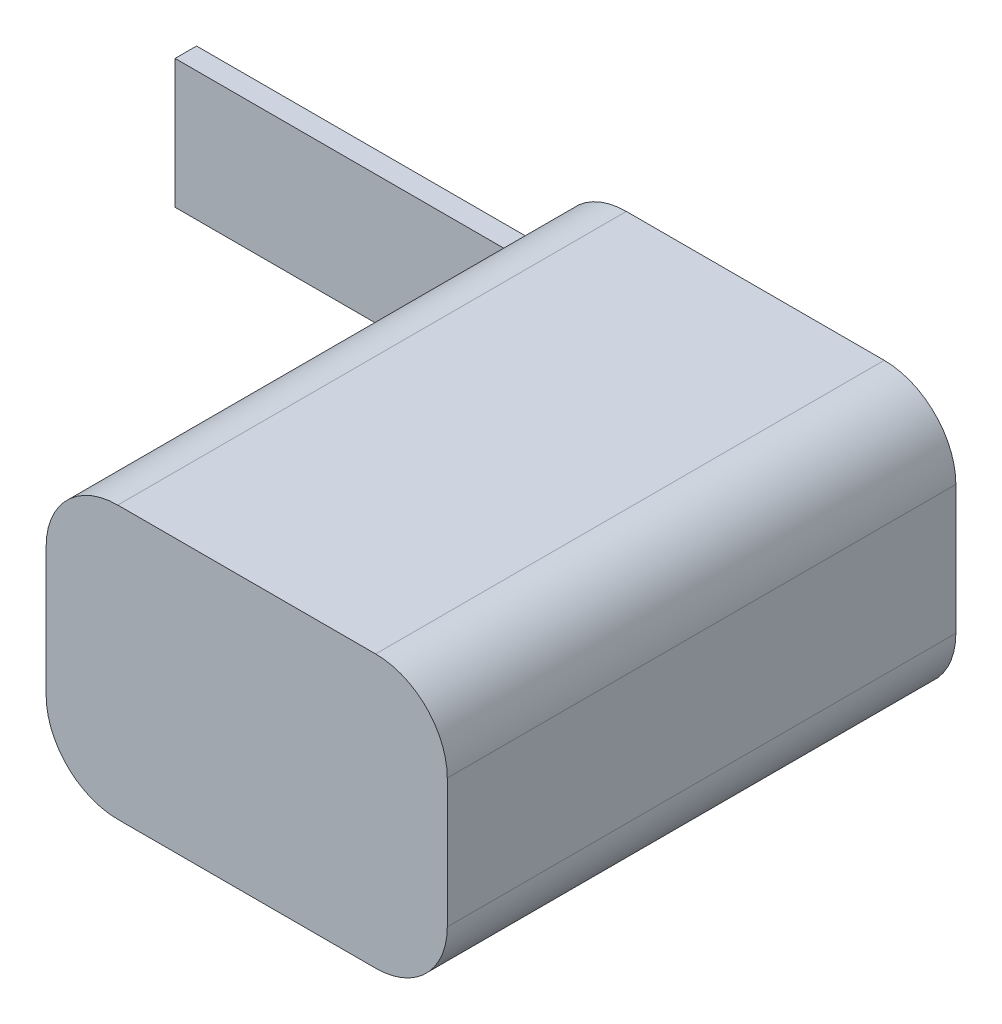
ISO-10303-21;
HEADER;
FILE_DESCRIPTION(('STEP AP214'),'2;1');
FILE_NAME('part.step','',(''),(''),'','','');
FILE_SCHEMA(('AUTOMOTIVE_DESIGN { 1 0 10303 214 1 1 1 1 }'));
ENDSEC;
DATA;
#1=APPLICATION_CONTEXT('core data for automotive mechanical design processes');
#2=APPLICATION_PROTOCOL_DEFINITION('international standard','automotive_design',2000,#1);
#3=PRODUCT_CONTEXT('',#1,'mechanical');
#4=PRODUCT('Part','Part','',(#3));
#5=PRODUCT_RELATED_PRODUCT_CATEGORY('part','',(#4));
#6=PRODUCT_DEFINITION_FORMATION('','',#4);
#7=PRODUCT_DEFINITION_CONTEXT('part definition',#1,'design');
#8=PRODUCT_DEFINITION('design','',#6,#7);
#9=PRODUCT_DEFINITION_SHAPE('','',#8);
#10=(LENGTH_UNIT() NAMED_UNIT(*) SI_UNIT(.MILLI.,.METRE.));
#11=(NAMED_UNIT(*) PLANE_ANGLE_UNIT() SI_UNIT($,.RADIAN.));
#12=(NAMED_UNIT(*) SI_UNIT($,.STERADIAN.) SOLID_ANGLE_UNIT());
#13=UNCERTAINTY_MEASURE_WITH_UNIT(LENGTH_MEASURE(1.E-05),#10,'distance_accuracy_value','');
#14=(GEOMETRIC_REPRESENTATION_CONTEXT(3) GLOBAL_UNCERTAINTY_ASSIGNED_CONTEXT((#13)) GLOBAL_UNIT_ASSIGNED_CONTEXT((#10,
#11,#12)) REPRESENTATION_CONTEXT('',''));
#15=CARTESIAN_POINT('',(0.,0.,0.));
#16=DIRECTION('',(0.,0.,1.));
#17=DIRECTION('',(1.,0.,0.));
#18=AXIS2_PLACEMENT_3D('',#15,#16,#17);
#19=CARTESIAN_POINT('',(0.,0.,71.));
#20=DIRECTION('',(1.,0.,0.));
#21=DIRECTION('',(0.,0.,-1.));
#22=AXIS2_PLACEMENT_3D('',#19,#20,#21);
#23=PLANE('',#22);
#24=DIRECTION('',(0.,1.,0.));
#25=VECTOR('',#24,1.);
#26=CARTESIAN_POINT('',(0.,28.,3.));
#27=LINE('',#26,#25);
#28=CARTESIAN_POINT('',(0.,10.,3.));
#29=VERTEX_POINT('',#28);
#30=CARTESIAN_POINT('',(0.,28.,3.));
#31=VERTEX_POINT('',#30);
#32=EDGE_CURVE('E60',#29,#31,#27,.T.);
#33=ORIENTED_EDGE('',*,*,#32,.F.);
#34=DIRECTION('',(0.,0.,-1.));
#35=VECTOR('',#34,1.);
#36=CARTESIAN_POINT('',(0.,10.,71.));
#37=LINE('',#36,#35);
#38=CARTESIAN_POINT('',(0.,10.,71.));
#39=VERTEX_POINT('',#38);
#40=EDGE_CURVE('E207',#29,#39,#37,.F.);
#41=ORIENTED_EDGE('',*,*,#40,.T.);
#42=DIRECTION('',(0.,-1.,0.));
#43=VECTOR('',#42,1.);
#44=CARTESIAN_POINT('',(0.,0.,71.));
#45=LINE('',#44,#43);
#46=CARTESIAN_POINT('',(0.,28.,71.));
#47=VERTEX_POINT('',#46);
#48=EDGE_CURVE('E163',#47,#39,#45,.T.);
#49=ORIENTED_EDGE('',*,*,#48,.F.);
#50=DIRECTION('',(0.,0.,-1.));
#51=VECTOR('',#50,1.);
#52=CARTESIAN_POINT('',(0.,28.,71.));
#53=LINE('',#52,#51);
#54=EDGE_CURVE('E205',#47,#31,#53,.T.);
#55=ORIENTED_EDGE('',*,*,#54,.T.);
#56=EDGE_LOOP('',(#33,#41,#49,#55));
#57=FACE_BOUND('',#56,.T.);
#58=ADVANCED_FACE('F45',(#57),#23,.F.);
#59=CARTESIAN_POINT('',(0.,0.,71.));
#60=DIRECTION('',(0.,1.,0.));
#61=DIRECTION('',(0.,0.,1.));
#62=AXIS2_PLACEMENT_3D('',#59,#60,#61);
#63=PLANE('',#62);
#64=DIRECTION('',(1.,0.,0.));
#65=VECTOR('',#64,1.);
#66=CARTESIAN_POINT('',(0.,0.,0.));
#67=LINE('',#66,#65);
#68=CARTESIAN_POINT('',(10.,0.,0.));
#69=VERTEX_POINT('',#68);
#70=CARTESIAN_POINT('',(46.,0.,0.));
#71=VERTEX_POINT('',#70);
#72=EDGE_CURVE('E154',#69,#71,#67,.T.);
#73=ORIENTED_EDGE('',*,*,#72,.T.);
#74=DIRECTION('',(0.,0.,-1.));
#75=VECTOR('',#74,1.);
#76=CARTESIAN_POINT('',(46.,0.,71.));
#77=LINE('',#76,#75);
#78=CARTESIAN_POINT('',(46.,0.,71.));
#79=VERTEX_POINT('',#78);
#80=EDGE_CURVE('E195',#71,#79,#77,.F.);
#81=ORIENTED_EDGE('',*,*,#80,.T.);
#82=DIRECTION('',(1.,0.,0.));
#83=VECTOR('',#82,1.);
#84=CARTESIAN_POINT('',(0.,0.,71.));
#85=LINE('',#84,#83);
#86=CARTESIAN_POINT('',(10.,0.,71.));
#87=VERTEX_POINT('',#86);
#88=EDGE_CURVE('E166',#87,#79,#85,.T.);
#89=ORIENTED_EDGE('',*,*,#88,.F.);
#90=DIRECTION('',(0.,0.,-1.));
#91=VECTOR('',#90,1.);
#92=CARTESIAN_POINT('',(10.,0.,71.));
#93=LINE('',#92,#91);
#94=EDGE_CURVE('E192',#87,#69,#93,.T.);
#95=ORIENTED_EDGE('',*,*,#94,.T.);
#96=EDGE_LOOP('',(#73,#81,#89,#95));
#97=FACE_BOUND('',#96,.T.);
#98=ADVANCED_FACE('F241',(#97),#63,.F.);
#99=CARTESIAN_POINT('',(56.,0.,71.));
#100=DIRECTION('',(-1.,0.,0.));
#101=DIRECTION('',(0.,0.,1.));
#102=AXIS2_PLACEMENT_3D('',#99,#100,#101);
#103=PLANE('',#102);
#104=DIRECTION('',(0.,1.,0.));
#105=VECTOR('',#104,1.);
#106=CARTESIAN_POINT('',(56.,0.,71.));
#107=LINE('',#106,#105);
#108=CARTESIAN_POINT('',(56.,10.,71.));
#109=VERTEX_POINT('',#108);
#110=CARTESIAN_POINT('',(56.,28.,71.));
#111=VERTEX_POINT('',#110);
#112=EDGE_CURVE('E170',#109,#111,#107,.T.);
#113=ORIENTED_EDGE('',*,*,#112,.F.);
#114=DIRECTION('',(0.,0.,-1.));
#115=VECTOR('',#114,1.);
#116=CARTESIAN_POINT('',(56.,10.,71.));
#117=LINE('',#116,#115);
#118=CARTESIAN_POINT('',(56.,10.,0.));
#119=VERTEX_POINT('',#118);
#120=EDGE_CURVE('E182',#109,#119,#117,.T.);
#121=ORIENTED_EDGE('',*,*,#120,.T.);
#122=DIRECTION('',(0.,1.,0.));
#123=VECTOR('',#122,1.);
#124=CARTESIAN_POINT('',(56.,0.,0.));
#125=LINE('',#124,#123);
#126=CARTESIAN_POINT('',(56.,28.,0.));
#127=VERTEX_POINT('',#126);
#128=EDGE_CURVE('E157',#119,#127,#125,.T.);
#129=ORIENTED_EDGE('',*,*,#128,.T.);
#130=DIRECTION('',(0.,0.,-1.));
#131=VECTOR('',#130,1.);
#132=CARTESIAN_POINT('',(56.,28.,71.));
#133=LINE('',#132,#131);
#134=EDGE_CURVE('E175',#127,#111,#133,.F.);
#135=ORIENTED_EDGE('',*,*,#134,.T.);
#136=EDGE_LOOP('',(#113,#121,#129,#135));
#137=FACE_BOUND('',#136,.T.);
#138=ADVANCED_FACE('F248',(#137),#103,.F.);
#139=CARTESIAN_POINT('',(0.,38.,71.));
#140=DIRECTION('',(0.,-1.,0.));
#141=DIRECTION('',(0.,0.,-1.));
#142=AXIS2_PLACEMENT_3D('',#139,#140,#141);
#143=PLANE('',#142);
#144=DIRECTION('',(-1.,0.,0.));
#145=VECTOR('',#144,1.);
#146=CARTESIAN_POINT('',(0.,38.,0.));
#147=LINE('',#146,#145);
#148=CARTESIAN_POINT('',(46.,38.,0.));
#149=VERTEX_POINT('',#148);
#150=CARTESIAN_POINT('',(10.,38.,0.));
#151=VERTEX_POINT('',#150);
#152=EDGE_CURVE('E167',#149,#151,#147,.T.);
#153=ORIENTED_EDGE('',*,*,#152,.T.);
#154=DIRECTION('',(0.,0.,-1.));
#155=VECTOR('',#154,1.);
#156=CARTESIAN_POINT('',(10.,38.,71.));
#157=LINE('',#156,#155);
#158=CARTESIAN_POINT('',(10.,38.,71.));
#159=VERTEX_POINT('',#158);
#160=EDGE_CURVE('E11',#151,#159,#157,.F.);
#161=ORIENTED_EDGE('',*,*,#160,.T.);
#162=DIRECTION('',(-1.,0.,0.));
#163=VECTOR('',#162,1.);
#164=CARTESIAN_POINT('',(0.,38.,71.));
#165=LINE('',#164,#163);
#166=CARTESIAN_POINT('',(46.,38.,71.));
#167=VERTEX_POINT('',#166);
#168=EDGE_CURVE('E173',#167,#159,#165,.T.);
#169=ORIENTED_EDGE('',*,*,#168,.F.);
#170=DIRECTION('',(0.,0.,-1.));
#171=VECTOR('',#170,1.);
#172=CARTESIAN_POINT('',(46.,38.,71.));
#173=LINE('',#172,#171);
#174=EDGE_CURVE('E53',#167,#149,#173,.T.);
#175=ORIENTED_EDGE('',*,*,#174,.T.);
#176=EDGE_LOOP('',(#153,#161,#169,#175));
#177=FACE_BOUND('',#176,.T.);
#178=ADVANCED_FACE('F214',(#177),#143,.F.);
#179=CARTESIAN_POINT('',(0.,0.,71.));
#180=DIRECTION('',(0.,0.,-1.));
#181=DIRECTION('',(-1.,0.,0.));
#182=AXIS2_PLACEMENT_3D('',#179,#180,#181);
#183=PLANE('',#182);
#184=ORIENTED_EDGE('',*,*,#88,.T.);
#185=CARTESIAN_POINT('',(46.,10.,71.));
#186=DIRECTION('',(0.,0.,-1.));
#187=DIRECTION('',(-1.,0.,0.));
#188=AXIS2_PLACEMENT_3D('',#185,#186,#187);
#189=CIRCLE('',#188,10.);
#190=EDGE_CURVE('E203',#79,#109,#189,.F.);
#191=ORIENTED_EDGE('',*,*,#190,.T.);
#192=ORIENTED_EDGE('',*,*,#112,.T.);
#193=CARTESIAN_POINT('',(46.,28.,71.));
#194=DIRECTION('',(0.,0.,-1.));
#195=DIRECTION('',(-1.,0.,0.));
#196=AXIS2_PLACEMENT_3D('',#193,#194,#195);
#197=CIRCLE('',#196,10.);
#198=EDGE_CURVE('E197',#111,#167,#197,.F.);
#199=ORIENTED_EDGE('',*,*,#198,.T.);
#200=ORIENTED_EDGE('',*,*,#168,.T.);
#201=CARTESIAN_POINT('',(10.,28.,71.));
#202=DIRECTION('',(0.,0.,-1.));
#203=DIRECTION('',(-1.,0.,0.));
#204=AXIS2_PLACEMENT_3D('',#201,#202,#203);
#205=CIRCLE('',#204,10.);
#206=EDGE_CURVE('E199',#159,#47,#205,.F.);
#207=ORIENTED_EDGE('',*,*,#206,.T.);
#208=ORIENTED_EDGE('',*,*,#48,.T.);
#209=CARTESIAN_POINT('',(10.,10.,71.));
#210=DIRECTION('',(0.,0.,-1.));
#211=DIRECTION('',(-1.,0.,0.));
#212=AXIS2_PLACEMENT_3D('',#209,#210,#211);
#213=CIRCLE('',#212,10.);
#214=EDGE_CURVE('E201',#39,#87,#213,.F.);
#215=ORIENTED_EDGE('',*,*,#214,.T.);
#216=EDGE_LOOP('',(#184,#191,#192,#199,#200,#207,#208,#215));
#217=FACE_BOUND('',#216,.T.);
#218=ADVANCED_FACE('F267',(#217),#183,.F.);
#219=CARTESIAN_POINT('',(0.,0.,0.));
#220=DIRECTION('',(0.,0.,-1.));
#221=DIRECTION('',(-1.,0.,0.));
#222=AXIS2_PLACEMENT_3D('',#219,#220,#221);
#223=PLANE('',#222);
#224=ORIENTED_EDGE('',*,*,#128,.F.);
#225=CARTESIAN_POINT('',(46.,10.,0.));
#226=DIRECTION('',(0.,0.,-1.));
#227=DIRECTION('',(-1.,0.,0.));
#228=AXIS2_PLACEMENT_3D('',#225,#226,#227);
#229=CIRCLE('',#228,10.);
#230=EDGE_CURVE('E190',#119,#71,#229,.T.);
#231=ORIENTED_EDGE('',*,*,#230,.T.);
#232=ORIENTED_EDGE('',*,*,#72,.F.);
#233=CARTESIAN_POINT('',(10.,10.,0.));
#234=DIRECTION('',(0.,0.,-1.));
#235=DIRECTION('',(-1.,0.,0.));
#236=AXIS2_PLACEMENT_3D('',#233,#234,#235);
#237=CIRCLE('',#236,10.);
#238=CARTESIAN_POINT('',(0.,10.,0.));
#239=VERTEX_POINT('',#238);
#240=EDGE_CURVE('E152',#69,#239,#237,.T.);
#241=ORIENTED_EDGE('',*,*,#240,.T.);
#242=DIRECTION('',(1.,0.,0.));
#243=VECTOR('',#242,1.);
#244=CARTESIAN_POINT('',(-50.,10.,0.));
#245=LINE('',#244,#243);
#246=CARTESIAN_POINT('',(-50.,10.,0.));
#247=VERTEX_POINT('',#246);
#248=EDGE_CURVE('E133',#247,#239,#245,.T.);
#249=ORIENTED_EDGE('',*,*,#248,.F.);
#250=DIRECTION('',(0.,-1.,0.));
#251=VECTOR('',#250,1.);
#252=CARTESIAN_POINT('',(-50.,28.,0.));
#253=LINE('',#252,#251);
#254=CARTESIAN_POINT('',(-50.,28.,0.));
#255=VERTEX_POINT('',#254);
#256=EDGE_CURVE('E139',#255,#247,#253,.T.);
#257=ORIENTED_EDGE('',*,*,#256,.F.);
#258=DIRECTION('',(1.,0.,0.));
#259=VECTOR('',#258,1.);
#260=CARTESIAN_POINT('',(-50.,28.,0.));
#261=LINE('',#260,#259);
#262=CARTESIAN_POINT('',(0.,28.,0.));
#263=VERTEX_POINT('',#262);
#264=EDGE_CURVE('E218',#255,#263,#261,.T.);
#265=ORIENTED_EDGE('',*,*,#264,.T.);
#266=CARTESIAN_POINT('',(10.,28.,0.));
#267=DIRECTION('',(0.,0.,-1.));
#268=DIRECTION('',(-1.,0.,0.));
#269=AXIS2_PLACEMENT_3D('',#266,#267,#268);
#270=CIRCLE('',#269,10.);
#271=EDGE_CURVE('E187',#263,#151,#270,.T.);
#272=ORIENTED_EDGE('',*,*,#271,.T.);
#273=ORIENTED_EDGE('',*,*,#152,.F.);
#274=CARTESIAN_POINT('',(46.,28.,0.));
#275=DIRECTION('',(0.,0.,-1.));
#276=DIRECTION('',(-1.,0.,0.));
#277=AXIS2_PLACEMENT_3D('',#274,#275,#276);
#278=CIRCLE('',#277,10.);
#279=EDGE_CURVE('E185',#149,#127,#278,.T.);
#280=ORIENTED_EDGE('',*,*,#279,.T.);
#281=EDGE_LOOP('',(#224,#231,#232,#241,#249,#257,#265,#272,#273,#280));
#282=FACE_BOUND('',#281,.T.);
#283=ADVANCED_FACE('F150',(#282),#223,.T.);
#284=CARTESIAN_POINT('',(46.,10.,71.));
#285=DIRECTION('',(0.,0.,-1.));
#286=DIRECTION('',(-1.,0.,0.));
#287=AXIS2_PLACEMENT_3D('',#284,#285,#286);
#288=CYLINDRICAL_SURFACE('',#287,10.);
#289=ORIENTED_EDGE('',*,*,#190,.F.);
#290=ORIENTED_EDGE('',*,*,#80,.F.);
#291=ORIENTED_EDGE('',*,*,#230,.F.);
#292=ORIENTED_EDGE('',*,*,#120,.F.);
#293=EDGE_LOOP('',(#289,#290,#291,#292));
#294=FACE_BOUND('',#293,.T.);
#295=ADVANCED_FACE('F253',(#294),#288,.T.);
#296=CARTESIAN_POINT('',(10.,10.,71.));
#297=DIRECTION('',(0.,0.,-1.));
#298=DIRECTION('',(-1.,0.,0.));
#299=AXIS2_PLACEMENT_3D('',#296,#297,#298);
#300=CYLINDRICAL_SURFACE('',#299,10.);
#301=ORIENTED_EDGE('',*,*,#214,.F.);
#302=ORIENTED_EDGE('',*,*,#40,.F.);
#303=EDGE_CURVE('E208',#239,#29,#37,.F.);
#304=ORIENTED_EDGE('',*,*,#303,.F.);
#305=ORIENTED_EDGE('',*,*,#240,.F.);
#306=ORIENTED_EDGE('',*,*,#94,.F.);
#307=EDGE_LOOP('',(#301,#302,#304,#305,#306));
#308=FACE_BOUND('',#307,.T.);
#309=ADVANCED_FACE('F256',(#308),#300,.T.);
#310=CARTESIAN_POINT('',(10.,28.,71.));
#311=DIRECTION('',(0.,0.,-1.));
#312=DIRECTION('',(-1.,0.,0.));
#313=AXIS2_PLACEMENT_3D('',#310,#311,#312);
#314=CYLINDRICAL_SURFACE('',#313,10.);
#315=ORIENTED_EDGE('',*,*,#206,.F.);
#316=ORIENTED_EDGE('',*,*,#160,.F.);
#317=ORIENTED_EDGE('',*,*,#271,.F.);
#318=DIRECTION('',(0.,0.,-1.));
#319=VECTOR('',#318,1.);
#320=CARTESIAN_POINT('',(0.,28.,0.));
#321=LINE('',#320,#319);
#322=EDGE_CURVE('E68',#31,#263,#321,.T.);
#323=ORIENTED_EDGE('',*,*,#322,.F.);
#324=ORIENTED_EDGE('',*,*,#54,.F.);
#325=EDGE_LOOP('',(#315,#316,#317,#323,#324));
#326=FACE_BOUND('',#325,.T.);
#327=ADVANCED_FACE('F220',(#326),#314,.T.);
#328=CARTESIAN_POINT('',(46.,28.,71.));
#329=DIRECTION('',(0.,0.,-1.));
#330=DIRECTION('',(-1.,0.,0.));
#331=AXIS2_PLACEMENT_3D('',#328,#329,#330);
#332=CYLINDRICAL_SURFACE('',#331,10.);
#333=ORIENTED_EDGE('',*,*,#198,.F.);
#334=ORIENTED_EDGE('',*,*,#134,.F.);
#335=ORIENTED_EDGE('',*,*,#279,.F.);
#336=ORIENTED_EDGE('',*,*,#174,.F.);
#337=EDGE_LOOP('',(#333,#334,#335,#336));
#338=FACE_BOUND('',#337,.T.);
#339=ADVANCED_FACE('F47',(#338),#332,.T.);
#340=CARTESIAN_POINT('',(-50.,10.,0.));
#341=DIRECTION('',(0.,1.,0.));
#342=DIRECTION('',(0.,0.,1.));
#343=AXIS2_PLACEMENT_3D('',#340,#341,#342);
#344=PLANE('',#343);
#345=ORIENTED_EDGE('',*,*,#303,.T.);
#346=DIRECTION('',(1.,0.,0.));
#347=VECTOR('',#346,1.);
#348=CARTESIAN_POINT('',(-50.,10.,3.));
#349=LINE('',#348,#347);
#350=CARTESIAN_POINT('',(-50.,10.,3.));
#351=VERTEX_POINT('',#350);
#352=EDGE_CURVE('E135',#351,#29,#349,.T.);
#353=ORIENTED_EDGE('',*,*,#352,.F.);
#354=DIRECTION('',(0.,0.,1.));
#355=VECTOR('',#354,1.);
#356=CARTESIAN_POINT('',(-50.,10.,0.));
#357=LINE('',#356,#355);
#358=EDGE_CURVE('E128',#247,#351,#357,.T.);
#359=ORIENTED_EDGE('',*,*,#358,.F.);
#360=ORIENTED_EDGE('',*,*,#248,.T.);
#361=EDGE_LOOP('',(#345,#353,#359,#360));
#362=FACE_BOUND('',#361,.T.);
#363=ADVANCED_FACE('F131',(#362),#344,.F.);
#364=CARTESIAN_POINT('',(-50.,28.,3.));
#365=DIRECTION('',(0.,0.,-1.));
#366=DIRECTION('',(0.,1.,0.));
#367=AXIS2_PLACEMENT_3D('',#364,#365,#366);
#368=PLANE('',#367);
#369=ORIENTED_EDGE('',*,*,#32,.T.);
#370=DIRECTION('',(1.,0.,0.));
#371=VECTOR('',#370,1.);
#372=CARTESIAN_POINT('',(-50.,28.,3.));
#373=LINE('',#372,#371);
#374=CARTESIAN_POINT('',(-50.,28.,3.));
#375=VERTEX_POINT('',#374);
#376=EDGE_CURVE('E159',#375,#31,#373,.T.);
#377=ORIENTED_EDGE('',*,*,#376,.F.);
#378=DIRECTION('',(0.,1.,0.));
#379=VECTOR('',#378,1.);
#380=CARTESIAN_POINT('',(-50.,28.,3.));
#381=LINE('',#380,#379);
#382=EDGE_CURVE('E138',#351,#375,#381,.T.);
#383=ORIENTED_EDGE('',*,*,#382,.F.);
#384=ORIENTED_EDGE('',*,*,#352,.T.);
#385=EDGE_LOOP('',(#369,#377,#383,#384));
#386=FACE_BOUND('',#385,.T.);
#387=ADVANCED_FACE('F231',(#386),#368,.F.);
#388=CARTESIAN_POINT('',(-50.,28.,0.));
#389=DIRECTION('',(0.,-1.,0.));
#390=DIRECTION('',(0.,0.,-1.));
#391=AXIS2_PLACEMENT_3D('',#388,#389,#390);
#392=PLANE('',#391);
#393=ORIENTED_EDGE('',*,*,#322,.T.);
#394=ORIENTED_EDGE('',*,*,#264,.F.);
#395=DIRECTION('',(0.,0.,-1.));
#396=VECTOR('',#395,1.);
#397=CARTESIAN_POINT('',(-50.,28.,0.));
#398=LINE('',#397,#396);
#399=EDGE_CURVE('E144',#375,#255,#398,.T.);
#400=ORIENTED_EDGE('',*,*,#399,.F.);
#401=ORIENTED_EDGE('',*,*,#376,.T.);
#402=EDGE_LOOP('',(#393,#394,#400,#401));
#403=FACE_BOUND('',#402,.T.);
#404=ADVANCED_FACE('F223',(#403),#392,.F.);
#405=CARTESIAN_POINT('',(-50.,0.,0.));
#406=DIRECTION('',(-1.,0.,0.));
#407=DIRECTION('',(0.,0.,1.));
#408=AXIS2_PLACEMENT_3D('',#405,#406,#407);
#409=PLANE('',#408);
#410=ORIENTED_EDGE('',*,*,#256,.T.);
#411=ORIENTED_EDGE('',*,*,#358,.T.);
#412=ORIENTED_EDGE('',*,*,#382,.T.);
#413=ORIENTED_EDGE('',*,*,#399,.T.);
#414=EDGE_LOOP('',(#410,#411,#412,#413));
#415=FACE_BOUND('',#414,.T.);
#416=ADVANCED_FACE('F142',(#415),#409,.T.);
#417=CLOSED_SHELL('',(#58,#98,#138,#178,#218,#283,#295,#309,#327,#339,#363,#387,#404,#416));
#418=MANIFOLD_SOLID_BREP('B2',#417);
#419=ADVANCED_BREP_SHAPE_REPRESENTATION('',(#18,#418),#14);
#420=SHAPE_DEFINITION_REPRESENTATION(#9,#419);
ENDSEC;
END-ISO-10303-21;
